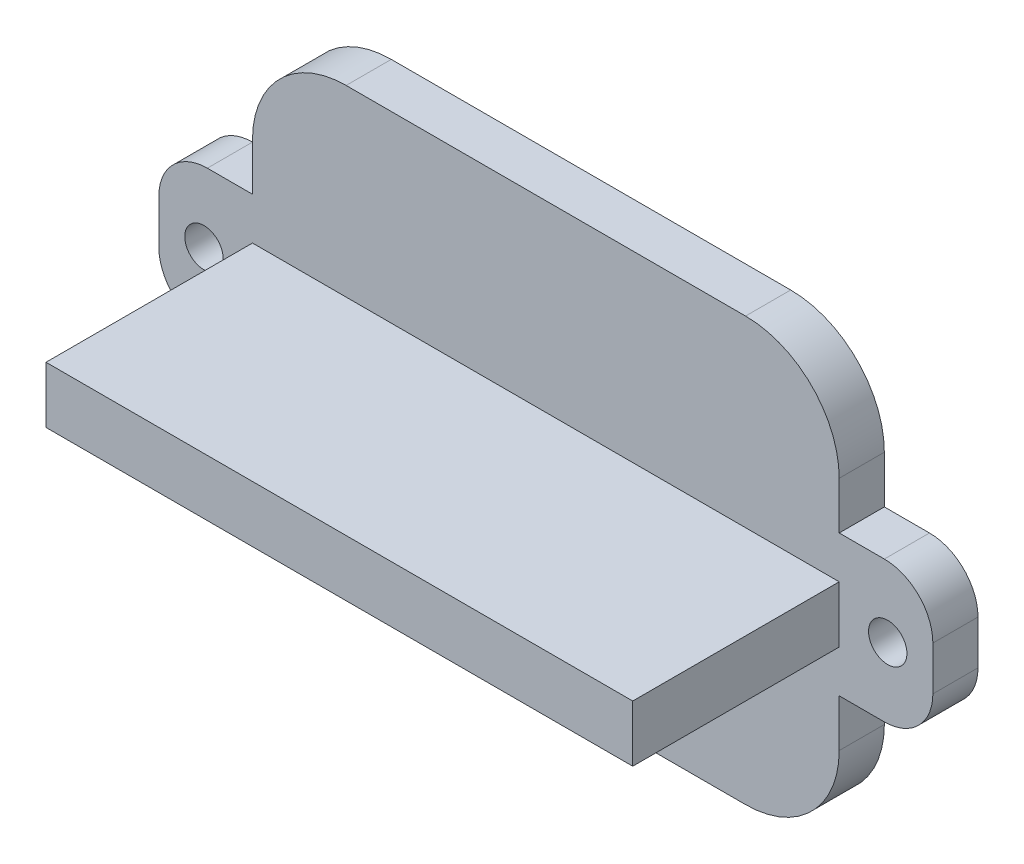
ISO-10303-21;
HEADER;
FILE_DESCRIPTION(('STEP AP214'),'2;1');
FILE_NAME('part.step','',(''),(''),'','','');
FILE_SCHEMA(('AUTOMOTIVE_DESIGN { 1 0 10303 214 1 1 1 1 }'));
ENDSEC;
DATA;
#1=APPLICATION_CONTEXT('core data for automotive mechanical design processes');
#2=APPLICATION_PROTOCOL_DEFINITION('international standard','automotive_design',2000,#1);
#3=PRODUCT_CONTEXT('',#1,'mechanical');
#4=PRODUCT('Part','Part','',(#3));
#5=PRODUCT_RELATED_PRODUCT_CATEGORY('part','',(#4));
#6=PRODUCT_DEFINITION_FORMATION('','',#4);
#7=PRODUCT_DEFINITION_CONTEXT('part definition',#1,'design');
#8=PRODUCT_DEFINITION('design','',#6,#7);
#9=PRODUCT_DEFINITION_SHAPE('','',#8);
#10=(LENGTH_UNIT() NAMED_UNIT(*) SI_UNIT(.MILLI.,.METRE.));
#11=(NAMED_UNIT(*) PLANE_ANGLE_UNIT() SI_UNIT($,.RADIAN.));
#12=(NAMED_UNIT(*) SI_UNIT($,.STERADIAN.) SOLID_ANGLE_UNIT());
#13=UNCERTAINTY_MEASURE_WITH_UNIT(LENGTH_MEASURE(1.E-05),#10,'distance_accuracy_value','');
#14=(GEOMETRIC_REPRESENTATION_CONTEXT(3) GLOBAL_UNCERTAINTY_ASSIGNED_CONTEXT((#13)) GLOBAL_UNIT_ASSIGNED_CONTEXT((#10,
#11,#12)) REPRESENTATION_CONTEXT('',''));
#15=CARTESIAN_POINT('',(0.,0.,0.));
#16=DIRECTION('',(0.,0.,1.));
#17=DIRECTION('',(1.,0.,0.));
#18=AXIS2_PLACEMENT_3D('',#15,#16,#17);
#19=CARTESIAN_POINT('',(0.,0.,2.));
#20=DIRECTION('',(0.,0.,1.));
#21=DIRECTION('',(1.,0.,0.));
#22=AXIS2_PLACEMENT_3D('',#19,#20,#21);
#23=PLANE('',#22);
#24=DIRECTION('',(-1.,0.,0.));
#25=VECTOR('',#24,1.);
#26=CARTESIAN_POINT('',(0.,-9.375,2.));
#27=LINE('',#26,#25);
#28=CARTESIAN_POINT('',(8.84999999999998,-9.375,2.));
#29=VERTEX_POINT('',#28);
#30=CARTESIAN_POINT('',(-8.84999999999997,-9.375,2.));
#31=VERTEX_POINT('',#30);
#32=EDGE_CURVE('E250',#29,#31,#27,.T.);
#33=ORIENTED_EDGE('',*,*,#32,.F.);
#34=CARTESIAN_POINT('',(8.85,-5.225,2.));
#35=DIRECTION('',(0.,0.,1.));
#36=DIRECTION('',(1.,0.,0.));
#37=AXIS2_PLACEMENT_3D('',#34,#35,#36);
#38=CIRCLE('',#37,4.15);
#39=CARTESIAN_POINT('',(13.,-5.22499999999997,2.));
#40=VERTEX_POINT('',#39);
#41=EDGE_CURVE('E248',#29,#40,#38,.T.);
#42=ORIENTED_EDGE('',*,*,#41,.T.);
#43=DIRECTION('',(0.,1.,0.));
#44=VECTOR('',#43,1.);
#45=CARTESIAN_POINT('',(13.,0.,2.));
#46=LINE('',#45,#44);
#47=CARTESIAN_POINT('',(13.,-3.125,2.));
#48=VERTEX_POINT('',#47);
#49=EDGE_CURVE('E246',#40,#48,#46,.T.);
#50=ORIENTED_EDGE('',*,*,#49,.T.);
#51=DIRECTION('',(-1.,0.,0.));
#52=VECTOR('',#51,1.);
#53=CARTESIAN_POINT('',(0.,-3.125,2.));
#54=LINE('',#53,#52);
#55=CARTESIAN_POINT('',(15.,-3.125,2.));
#56=VERTEX_POINT('',#55);
#57=EDGE_CURVE('E243',#56,#48,#54,.T.);
#58=ORIENTED_EDGE('',*,*,#57,.F.);
#59=CARTESIAN_POINT('',(15.,-0.974999999999999,2.));
#60=DIRECTION('',(0.,0.,1.));
#61=DIRECTION('',(1.,0.,0.));
#62=AXIS2_PLACEMENT_3D('',#59,#60,#61);
#63=CIRCLE('',#62,2.15);
#64=CARTESIAN_POINT('',(17.15,-0.974999999999984,2.));
#65=VERTEX_POINT('',#64);
#66=EDGE_CURVE('E241',#56,#65,#63,.T.);
#67=ORIENTED_EDGE('',*,*,#66,.T.);
#68=DIRECTION('',(0.,1.,0.));
#69=VECTOR('',#68,1.);
#70=CARTESIAN_POINT('',(17.15,0.,2.));
#71=LINE('',#70,#69);
#72=CARTESIAN_POINT('',(17.15,0.974999999999984,2.));
#73=VERTEX_POINT('',#72);
#74=EDGE_CURVE('E239',#65,#73,#71,.T.);
#75=ORIENTED_EDGE('',*,*,#74,.T.);
#76=CARTESIAN_POINT('',(15.,0.975,2.));
#77=DIRECTION('',(0.,0.,1.));
#78=DIRECTION('',(1.,0.,0.));
#79=AXIS2_PLACEMENT_3D('',#76,#77,#78);
#80=CIRCLE('',#79,2.15);
#81=CARTESIAN_POINT('',(15.,3.125,2.));
#82=VERTEX_POINT('',#81);
#83=EDGE_CURVE('E237',#73,#82,#80,.T.);
#84=ORIENTED_EDGE('',*,*,#83,.T.);
#85=DIRECTION('',(-1.,0.,0.));
#86=VECTOR('',#85,1.);
#87=CARTESIAN_POINT('',(0.,3.125,2.));
#88=LINE('',#87,#86);
#89=CARTESIAN_POINT('',(13.,3.125,2.));
#90=VERTEX_POINT('',#89);
#91=EDGE_CURVE('E235',#82,#90,#88,.T.);
#92=ORIENTED_EDGE('',*,*,#91,.T.);
#93=CARTESIAN_POINT('',(13.,5.22499999999997,2.));
#94=VERTEX_POINT('',#93);
#95=EDGE_CURVE('E234',#90,#94,#46,.T.);
#96=ORIENTED_EDGE('',*,*,#95,.T.);
#97=CARTESIAN_POINT('',(8.85,5.225,2.));
#98=DIRECTION('',(0.,0.,1.));
#99=DIRECTION('',(1.,0.,0.));
#100=AXIS2_PLACEMENT_3D('',#97,#98,#99);
#101=CIRCLE('',#100,4.15);
#102=CARTESIAN_POINT('',(8.84999999999998,9.375,2.));
#103=VERTEX_POINT('',#102);
#104=EDGE_CURVE('E230',#94,#103,#101,.T.);
#105=ORIENTED_EDGE('',*,*,#104,.T.);
#106=DIRECTION('',(-1.,0.,0.));
#107=VECTOR('',#106,1.);
#108=CARTESIAN_POINT('',(0.,9.375,2.));
#109=LINE('',#108,#107);
#110=CARTESIAN_POINT('',(-8.84999999999997,9.375,2.));
#111=VERTEX_POINT('',#110);
#112=EDGE_CURVE('E227',#103,#111,#109,.T.);
#113=ORIENTED_EDGE('',*,*,#112,.T.);
#114=CARTESIAN_POINT('',(-8.84999999999999,5.225,2.));
#115=DIRECTION('',(0.,0.,1.));
#116=DIRECTION('',(1.,0.,0.));
#117=AXIS2_PLACEMENT_3D('',#114,#115,#116);
#118=CIRCLE('',#117,4.15);
#119=CARTESIAN_POINT('',(-13.,5.22499999999997,2.));
#120=VERTEX_POINT('',#119);
#121=EDGE_CURVE('E222',#120,#111,#118,.F.);
#122=ORIENTED_EDGE('',*,*,#121,.F.);
#123=DIRECTION('',(0.,1.,0.));
#124=VECTOR('',#123,1.);
#125=CARTESIAN_POINT('',(-13.,0.,2.));
#126=LINE('',#125,#124);
#127=CARTESIAN_POINT('',(-13.,3.125,2.));
#128=VERTEX_POINT('',#127);
#129=EDGE_CURVE('E215',#128,#120,#126,.T.);
#130=ORIENTED_EDGE('',*,*,#129,.F.);
#131=DIRECTION('',(-1.,0.,0.));
#132=VECTOR('',#131,1.);
#133=CARTESIAN_POINT('',(0.,3.125,2.));
#134=LINE('',#133,#132);
#135=CARTESIAN_POINT('',(-15.,3.125,2.));
#136=VERTEX_POINT('',#135);
#137=EDGE_CURVE('E221',#128,#136,#134,.T.);
#138=ORIENTED_EDGE('',*,*,#137,.T.);
#139=CARTESIAN_POINT('',(-15.,0.975,2.));
#140=DIRECTION('',(0.,0.,1.));
#141=DIRECTION('',(1.,0.,0.));
#142=AXIS2_PLACEMENT_3D('',#139,#140,#141);
#143=CIRCLE('',#142,2.15);
#144=CARTESIAN_POINT('',(-17.15,0.974999999999985,2.));
#145=VERTEX_POINT('',#144);
#146=EDGE_CURVE('E225',#136,#145,#143,.T.);
#147=ORIENTED_EDGE('',*,*,#146,.T.);
#148=DIRECTION('',(0.,1.,0.));
#149=VECTOR('',#148,1.);
#150=CARTESIAN_POINT('',(-17.15,0.,2.));
#151=LINE('',#150,#149);
#152=CARTESIAN_POINT('',(-17.15,-0.974999999999984,2.));
#153=VERTEX_POINT('',#152);
#154=EDGE_CURVE('E520',#153,#145,#151,.T.);
#155=ORIENTED_EDGE('',*,*,#154,.F.);
#156=CARTESIAN_POINT('',(-15.,-0.974999999999999,2.));
#157=DIRECTION('',(0.,0.,1.));
#158=DIRECTION('',(1.,0.,0.));
#159=AXIS2_PLACEMENT_3D('',#156,#157,#158);
#160=CIRCLE('',#159,2.15);
#161=CARTESIAN_POINT('',(-15.,-3.125,2.));
#162=VERTEX_POINT('',#161);
#163=EDGE_CURVE('E210',#162,#153,#160,.F.);
#164=ORIENTED_EDGE('',*,*,#163,.F.);
#165=DIRECTION('',(-1.,0.,0.));
#166=VECTOR('',#165,1.);
#167=CARTESIAN_POINT('',(0.,-3.125,2.));
#168=LINE('',#167,#166);
#169=CARTESIAN_POINT('',(-13.,-3.125,2.));
#170=VERTEX_POINT('',#169);
#171=EDGE_CURVE('E191',#170,#162,#168,.T.);
#172=ORIENTED_EDGE('',*,*,#171,.F.);
#173=CARTESIAN_POINT('',(-13.,-5.22499999999997,2.));
#174=VERTEX_POINT('',#173);
#175=EDGE_CURVE('E207',#174,#170,#126,.T.);
#176=ORIENTED_EDGE('',*,*,#175,.F.);
#177=CARTESIAN_POINT('',(-8.84999999999999,-5.225,2.));
#178=DIRECTION('',(0.,0.,1.));
#179=DIRECTION('',(1.,0.,0.));
#180=AXIS2_PLACEMENT_3D('',#177,#178,#179);
#181=CIRCLE('',#180,4.15);
#182=EDGE_CURVE('E213',#31,#174,#181,.F.);
#183=ORIENTED_EDGE('',*,*,#182,.F.);
#184=EDGE_LOOP('',(#33,#42,#50,#58,#67,#75,#84,#92,#96,#105,#113,#122,#130,#138,#147,#155,#164,
#172,#176,#183));
#185=FACE_BOUND('',#184,.T.);
#186=CARTESIAN_POINT('',(-15.15,0.,2.));
#187=DIRECTION('',(0.,0.,1.));
#188=DIRECTION('',(1.,0.,0.));
#189=AXIS2_PLACEMENT_3D('',#186,#187,#188);
#190=CIRCLE('',#189,0.850000000000011);
#191=CARTESIAN_POINT('',(-14.3,0.,2.));
#192=VERTEX_POINT('',#191);
#193=EDGE_CURVE('E216',#192,#192,#190,.T.);
#194=ORIENTED_EDGE('',*,*,#193,.F.);
#195=EDGE_LOOP('',(#194));
#196=FACE_BOUND('',#195,.T.);
#197=CARTESIAN_POINT('',(15.15,0.,2.));
#198=DIRECTION('',(0.,0.,1.));
#199=DIRECTION('',(1.,0.,0.));
#200=AXIS2_PLACEMENT_3D('',#197,#198,#199);
#201=CIRCLE('',#200,0.850000000000002);
#202=CARTESIAN_POINT('',(16.,0.,2.));
#203=VERTEX_POINT('',#202);
#204=EDGE_CURVE('E477',#203,#203,#201,.T.);
#205=ORIENTED_EDGE('',*,*,#204,.F.);
#206=EDGE_LOOP('',(#205));
#207=FACE_BOUND('',#206,.T.);
#208=DIRECTION('',(-1.,0.,0.));
#209=VECTOR('',#208,1.);
#210=CARTESIAN_POINT('',(0.,-1.2516224002639,2.));
#211=LINE('',#210,#209);
#212=CARTESIAN_POINT('',(13.,-1.2516224002639,2.));
#213=VERTEX_POINT('',#212);
#214=CARTESIAN_POINT('',(-13.,-1.2516224002639,2.));
#215=VERTEX_POINT('',#214);
#216=EDGE_CURVE('E257',#213,#215,#211,.T.);
#217=ORIENTED_EDGE('',*,*,#216,.T.);
#218=DIRECTION('',(0.,1.,0.));
#219=VECTOR('',#218,1.);
#220=CARTESIAN_POINT('',(-13.,0.,2.));
#221=LINE('',#220,#219);
#222=CARTESIAN_POINT('',(-13.,1.2516224002639,2.));
#223=VERTEX_POINT('',#222);
#224=EDGE_CURVE('E253',#215,#223,#221,.T.);
#225=ORIENTED_EDGE('',*,*,#224,.T.);
#226=DIRECTION('',(1.,0.,0.));
#227=VECTOR('',#226,1.);
#228=CARTESIAN_POINT('',(0.,1.2516224002639,2.));
#229=LINE('',#228,#227);
#230=CARTESIAN_POINT('',(13.,1.2516224002639,2.));
#231=VERTEX_POINT('',#230);
#232=EDGE_CURVE('E263',#223,#231,#229,.T.);
#233=ORIENTED_EDGE('',*,*,#232,.T.);
#234=DIRECTION('',(0.,-1.,0.));
#235=VECTOR('',#234,1.);
#236=CARTESIAN_POINT('',(13.,0.,2.));
#237=LINE('',#236,#235);
#238=EDGE_CURVE('E260',#231,#213,#237,.T.);
#239=ORIENTED_EDGE('',*,*,#238,.T.);
#240=EDGE_LOOP('',(#217,#225,#233,#239));
#241=FACE_BOUND('',#240,.T.);
#242=ADVANCED_FACE('F39',(#185,#196,#207,#241),#23,.T.);
#243=CARTESIAN_POINT('',(0.,-9.375,2.));
#244=DIRECTION('',(0.,-1.,0.));
#245=DIRECTION('',(1.,0.,0.));
#246=AXIS2_PLACEMENT_3D('',#243,#244,#245);
#247=PLANE('',#246);
#248=DIRECTION('',(-1.,0.,0.));
#249=VECTOR('',#248,1.);
#250=CARTESIAN_POINT('',(0.,-9.375,0.));
#251=LINE('',#250,#249);
#252=CARTESIAN_POINT('',(8.84999999999998,-9.375,0.));
#253=VERTEX_POINT('',#252);
#254=CARTESIAN_POINT('',(-8.84999999999997,-9.375,0.));
#255=VERTEX_POINT('',#254);
#256=EDGE_CURVE('E256',#253,#255,#251,.T.);
#257=ORIENTED_EDGE('',*,*,#256,.F.);
#258=DIRECTION('',(0.,0.,-1.));
#259=VECTOR('',#258,1.);
#260=CARTESIAN_POINT('',(8.84999999999998,-9.375,2.));
#261=LINE('',#260,#259);
#262=EDGE_CURVE('E11',#29,#253,#261,.T.);
#263=ORIENTED_EDGE('',*,*,#262,.F.);
#264=ORIENTED_EDGE('',*,*,#32,.T.);
#265=DIRECTION('',(0.,0.,-1.));
#266=VECTOR('',#265,1.);
#267=CARTESIAN_POINT('',(-8.84999999999997,-9.375,2.));
#268=LINE('',#267,#266);
#269=EDGE_CURVE('E63',#31,#255,#268,.T.);
#270=ORIENTED_EDGE('',*,*,#269,.T.);
#271=EDGE_LOOP('',(#257,#263,#264,#270));
#272=FACE_BOUND('',#271,.T.);
#273=ADVANCED_FACE('F41',(#272),#247,.T.);
#274=CARTESIAN_POINT('',(8.85,-5.225,2.));
#275=DIRECTION('',(0.,0.,-1.));
#276=DIRECTION('',(-1.,0.,0.));
#277=AXIS2_PLACEMENT_3D('',#274,#275,#276);
#278=CYLINDRICAL_SURFACE('',#277,4.15);
#279=CARTESIAN_POINT('',(8.85,-5.225,0.));
#280=DIRECTION('',(0.,0.,1.));
#281=DIRECTION('',(1.,0.,0.));
#282=AXIS2_PLACEMENT_3D('',#279,#280,#281);
#283=CIRCLE('',#282,4.15);
#284=CARTESIAN_POINT('',(13.,-5.22499999999997,0.));
#285=VERTEX_POINT('',#284);
#286=EDGE_CURVE('E412',#253,#285,#283,.T.);
#287=ORIENTED_EDGE('',*,*,#286,.T.);
#288=DIRECTION('',(0.,0.,-1.));
#289=VECTOR('',#288,1.);
#290=CARTESIAN_POINT('',(13.,-5.22499999999997,2.));
#291=LINE('',#290,#289);
#292=EDGE_CURVE('E47',#40,#285,#291,.T.);
#293=ORIENTED_EDGE('',*,*,#292,.F.);
#294=ORIENTED_EDGE('',*,*,#41,.F.);
#295=ORIENTED_EDGE('',*,*,#262,.T.);
#296=EDGE_LOOP('',(#287,#293,#294,#295));
#297=FACE_BOUND('',#296,.T.);
#298=ADVANCED_FACE('F329',(#297),#278,.T.);
#299=CARTESIAN_POINT('',(13.,0.,2.));
#300=DIRECTION('',(-1.,0.,0.));
#301=DIRECTION('',(0.,0.,1.));
#302=AXIS2_PLACEMENT_3D('',#299,#300,#301);
#303=PLANE('',#302);
#304=DIRECTION('',(0.,1.,0.));
#305=VECTOR('',#304,1.);
#306=CARTESIAN_POINT('',(13.,0.,0.));
#307=LINE('',#306,#305);
#308=CARTESIAN_POINT('',(13.,-3.125,0.));
#309=VERTEX_POINT('',#308);
#310=EDGE_CURVE('E417',#285,#309,#307,.T.);
#311=ORIENTED_EDGE('',*,*,#310,.T.);
#312=DIRECTION('',(0.,0.,-1.));
#313=VECTOR('',#312,1.);
#314=CARTESIAN_POINT('',(13.,-3.125,2.));
#315=LINE('',#314,#313);
#316=EDGE_CURVE('E422',#48,#309,#315,.T.);
#317=ORIENTED_EDGE('',*,*,#316,.F.);
#318=ORIENTED_EDGE('',*,*,#49,.F.);
#319=ORIENTED_EDGE('',*,*,#292,.T.);
#320=EDGE_LOOP('',(#311,#317,#318,#319));
#321=FACE_BOUND('',#320,.T.);
#322=ADVANCED_FACE('F385',(#321),#303,.F.);
#323=CARTESIAN_POINT('',(0.,-3.125,2.));
#324=DIRECTION('',(0.,-1.,0.));
#325=DIRECTION('',(0.,0.,-1.));
#326=AXIS2_PLACEMENT_3D('',#323,#324,#325);
#327=PLANE('',#326);
#328=DIRECTION('',(-1.,0.,0.));
#329=VECTOR('',#328,1.);
#330=CARTESIAN_POINT('',(0.,-3.125,0.));
#331=LINE('',#330,#329);
#332=CARTESIAN_POINT('',(15.,-3.125,0.));
#333=VERTEX_POINT('',#332);
#334=EDGE_CURVE('E425',#333,#309,#331,.T.);
#335=ORIENTED_EDGE('',*,*,#334,.F.);
#336=DIRECTION('',(0.,0.,-1.));
#337=VECTOR('',#336,1.);
#338=CARTESIAN_POINT('',(15.,-3.125,2.));
#339=LINE('',#338,#337);
#340=EDGE_CURVE('E508',#56,#333,#339,.T.);
#341=ORIENTED_EDGE('',*,*,#340,.F.);
#342=ORIENTED_EDGE('',*,*,#57,.T.);
#343=ORIENTED_EDGE('',*,*,#316,.T.);
#344=EDGE_LOOP('',(#335,#341,#342,#343));
#345=FACE_BOUND('',#344,.T.);
#346=ADVANCED_FACE('F400',(#345),#327,.T.);
#347=CARTESIAN_POINT('',(15.,-0.974999999999999,2.));
#348=DIRECTION('',(0.,0.,-1.));
#349=DIRECTION('',(-1.,0.,0.));
#350=AXIS2_PLACEMENT_3D('',#347,#348,#349);
#351=CYLINDRICAL_SURFACE('',#350,2.15);
#352=CARTESIAN_POINT('',(15.,-0.974999999999999,0.));
#353=DIRECTION('',(0.,0.,1.));
#354=DIRECTION('',(1.,0.,0.));
#355=AXIS2_PLACEMENT_3D('',#352,#353,#354);
#356=CIRCLE('',#355,2.15);
#357=CARTESIAN_POINT('',(17.15,-0.974999999999984,0.));
#358=VERTEX_POINT('',#357);
#359=EDGE_CURVE('E428',#333,#358,#356,.T.);
#360=ORIENTED_EDGE('',*,*,#359,.T.);
#361=DIRECTION('',(0.,0.,-1.));
#362=VECTOR('',#361,1.);
#363=CARTESIAN_POINT('',(17.15,-0.974999999999984,2.));
#364=LINE('',#363,#362);
#365=EDGE_CURVE('E505',#65,#358,#364,.T.);
#366=ORIENTED_EDGE('',*,*,#365,.F.);
#367=ORIENTED_EDGE('',*,*,#66,.F.);
#368=ORIENTED_EDGE('',*,*,#340,.T.);
#369=EDGE_LOOP('',(#360,#366,#367,#368));
#370=FACE_BOUND('',#369,.T.);
#371=ADVANCED_FACE('F396',(#370),#351,.T.);
#372=CARTESIAN_POINT('',(17.15,0.,2.));
#373=DIRECTION('',(-1.,0.,0.));
#374=DIRECTION('',(0.,0.,1.));
#375=AXIS2_PLACEMENT_3D('',#372,#373,#374);
#376=PLANE('',#375);
#377=DIRECTION('',(0.,1.,0.));
#378=VECTOR('',#377,1.);
#379=CARTESIAN_POINT('',(17.15,0.,0.));
#380=LINE('',#379,#378);
#381=CARTESIAN_POINT('',(17.15,0.974999999999984,0.));
#382=VERTEX_POINT('',#381);
#383=EDGE_CURVE('E443',#358,#382,#380,.T.);
#384=ORIENTED_EDGE('',*,*,#383,.T.);
#385=DIRECTION('',(0.,0.,-1.));
#386=VECTOR('',#385,1.);
#387=CARTESIAN_POINT('',(17.15,0.974999999999984,2.));
#388=LINE('',#387,#386);
#389=EDGE_CURVE('E502',#73,#382,#388,.T.);
#390=ORIENTED_EDGE('',*,*,#389,.F.);
#391=ORIENTED_EDGE('',*,*,#74,.F.);
#392=ORIENTED_EDGE('',*,*,#365,.T.);
#393=EDGE_LOOP('',(#384,#390,#391,#392));
#394=FACE_BOUND('',#393,.T.);
#395=ADVANCED_FACE('F392',(#394),#376,.F.);
#396=CARTESIAN_POINT('',(15.,0.975,2.));
#397=DIRECTION('',(0.,0.,-1.));
#398=DIRECTION('',(-1.,0.,0.));
#399=AXIS2_PLACEMENT_3D('',#396,#397,#398);
#400=CYLINDRICAL_SURFACE('',#399,2.15);
#401=CARTESIAN_POINT('',(15.,0.975,0.));
#402=DIRECTION('',(0.,0.,1.));
#403=DIRECTION('',(1.,0.,0.));
#404=AXIS2_PLACEMENT_3D('',#401,#402,#403);
#405=CIRCLE('',#404,2.15);
#406=CARTESIAN_POINT('',(15.,3.125,0.));
#407=VERTEX_POINT('',#406);
#408=EDGE_CURVE('E438',#382,#407,#405,.T.);
#409=ORIENTED_EDGE('',*,*,#408,.T.);
#410=DIRECTION('',(0.,0.,-1.));
#411=VECTOR('',#410,1.);
#412=CARTESIAN_POINT('',(15.,3.125,2.));
#413=LINE('',#412,#411);
#414=EDGE_CURVE('E500',#82,#407,#413,.T.);
#415=ORIENTED_EDGE('',*,*,#414,.F.);
#416=ORIENTED_EDGE('',*,*,#83,.F.);
#417=ORIENTED_EDGE('',*,*,#389,.T.);
#418=EDGE_LOOP('',(#409,#415,#416,#417));
#419=FACE_BOUND('',#418,.T.);
#420=ADVANCED_FACE('F388',(#419),#400,.T.);
#421=CARTESIAN_POINT('',(0.,3.125,2.));
#422=DIRECTION('',(0.,-1.,0.));
#423=DIRECTION('',(0.,0.,-1.));
#424=AXIS2_PLACEMENT_3D('',#421,#422,#423);
#425=PLANE('',#424);
#426=DIRECTION('',(-1.,0.,0.));
#427=VECTOR('',#426,1.);
#428=CARTESIAN_POINT('',(0.,3.125,0.));
#429=LINE('',#428,#427);
#430=CARTESIAN_POINT('',(13.,3.125,0.));
#431=VERTEX_POINT('',#430);
#432=EDGE_CURVE('E431',#407,#431,#429,.T.);
#433=ORIENTED_EDGE('',*,*,#432,.T.);
#434=DIRECTION('',(0.,0.,-1.));
#435=VECTOR('',#434,1.);
#436=CARTESIAN_POINT('',(13.,3.125,2.));
#437=LINE('',#436,#435);
#438=EDGE_CURVE('E498',#90,#431,#437,.T.);
#439=ORIENTED_EDGE('',*,*,#438,.F.);
#440=ORIENTED_EDGE('',*,*,#91,.F.);
#441=ORIENTED_EDGE('',*,*,#414,.T.);
#442=EDGE_LOOP('',(#433,#439,#440,#441));
#443=FACE_BOUND('',#442,.T.);
#444=ADVANCED_FACE('F383',(#443),#425,.F.);
#445=CARTESIAN_POINT('',(13.,5.22499999999997,0.));
#446=VERTEX_POINT('',#445);
#447=EDGE_CURVE('E427',#431,#446,#307,.T.);
#448=ORIENTED_EDGE('',*,*,#447,.T.);
#449=DIRECTION('',(0.,0.,-1.));
#450=VECTOR('',#449,1.);
#451=CARTESIAN_POINT('',(13.,5.22499999999997,2.));
#452=LINE('',#451,#450);
#453=EDGE_CURVE('E496',#94,#446,#452,.T.);
#454=ORIENTED_EDGE('',*,*,#453,.F.);
#455=ORIENTED_EDGE('',*,*,#95,.F.);
#456=ORIENTED_EDGE('',*,*,#438,.T.);
#457=EDGE_LOOP('',(#448,#454,#455,#456));
#458=FACE_BOUND('',#457,.T.);
#459=ADVANCED_FACE('F379',(#458),#303,.F.);
#460=CARTESIAN_POINT('',(8.85,5.225,2.));
#461=DIRECTION('',(0.,0.,-1.));
#462=DIRECTION('',(-1.,0.,0.));
#463=AXIS2_PLACEMENT_3D('',#460,#461,#462);
#464=CYLINDRICAL_SURFACE('',#463,4.15);
#465=CARTESIAN_POINT('',(8.85,5.225,0.));
#466=DIRECTION('',(0.,0.,1.));
#467=DIRECTION('',(1.,0.,0.));
#468=AXIS2_PLACEMENT_3D('',#465,#466,#467);
#469=CIRCLE('',#468,4.15);
#470=CARTESIAN_POINT('',(8.84999999999998,9.375,0.));
#471=VERTEX_POINT('',#470);
#472=EDGE_CURVE('E430',#446,#471,#469,.T.);
#473=ORIENTED_EDGE('',*,*,#472,.T.);
#474=DIRECTION('',(0.,0.,-1.));
#475=VECTOR('',#474,1.);
#476=CARTESIAN_POINT('',(8.84999999999998,9.375,2.));
#477=LINE('',#476,#475);
#478=EDGE_CURVE('E493',#103,#471,#477,.T.);
#479=ORIENTED_EDGE('',*,*,#478,.F.);
#480=ORIENTED_EDGE('',*,*,#104,.F.);
#481=ORIENTED_EDGE('',*,*,#453,.T.);
#482=EDGE_LOOP('',(#473,#479,#480,#481));
#483=FACE_BOUND('',#482,.T.);
#484=ADVANCED_FACE('F375',(#483),#464,.T.);
#485=CARTESIAN_POINT('',(0.,9.375,2.));
#486=DIRECTION('',(0.,-1.,0.));
#487=DIRECTION('',(1.,0.,0.));
#488=AXIS2_PLACEMENT_3D('',#485,#486,#487);
#489=PLANE('',#488);
#490=DIRECTION('',(-1.,0.,0.));
#491=VECTOR('',#490,1.);
#492=CARTESIAN_POINT('',(0.,9.375,0.));
#493=LINE('',#492,#491);
#494=CARTESIAN_POINT('',(-8.84999999999997,9.375,0.));
#495=VERTEX_POINT('',#494);
#496=EDGE_CURVE('E436',#471,#495,#493,.T.);
#497=ORIENTED_EDGE('',*,*,#496,.T.);
#498=DIRECTION('',(0.,0.,-1.));
#499=VECTOR('',#498,1.);
#500=CARTESIAN_POINT('',(-8.84999999999997,9.375,2.));
#501=LINE('',#500,#499);
#502=EDGE_CURVE('E491',#111,#495,#501,.T.);
#503=ORIENTED_EDGE('',*,*,#502,.F.);
#504=ORIENTED_EDGE('',*,*,#112,.F.);
#505=ORIENTED_EDGE('',*,*,#478,.T.);
#506=EDGE_LOOP('',(#497,#503,#504,#505));
#507=FACE_BOUND('',#506,.T.);
#508=ADVANCED_FACE('F372',(#507),#489,.F.);
#509=CARTESIAN_POINT('',(-8.84999999999999,5.225,2.));
#510=DIRECTION('',(0.,0.,-1.));
#511=DIRECTION('',(-1.,0.,0.));
#512=AXIS2_PLACEMENT_3D('',#509,#510,#511);
#513=CYLINDRICAL_SURFACE('',#512,4.15);
#514=CARTESIAN_POINT('',(-8.84999999999999,5.225,0.));
#515=DIRECTION('',(0.,0.,1.));
#516=DIRECTION('',(1.,0.,0.));
#517=AXIS2_PLACEMENT_3D('',#514,#515,#516);
#518=CIRCLE('',#517,4.15);
#519=CARTESIAN_POINT('',(-13.,5.22499999999997,0.));
#520=VERTEX_POINT('',#519);
#521=EDGE_CURVE('E449',#520,#495,#518,.F.);
#522=ORIENTED_EDGE('',*,*,#521,.F.);
#523=DIRECTION('',(0.,0.,-1.));
#524=VECTOR('',#523,1.);
#525=CARTESIAN_POINT('',(-13.,5.22499999999997,2.));
#526=LINE('',#525,#524);
#527=EDGE_CURVE('E489',#120,#520,#526,.T.);
#528=ORIENTED_EDGE('',*,*,#527,.F.);
#529=ORIENTED_EDGE('',*,*,#121,.T.);
#530=ORIENTED_EDGE('',*,*,#502,.T.);
#531=EDGE_LOOP('',(#522,#528,#529,#530));
#532=FACE_BOUND('',#531,.T.);
#533=ADVANCED_FACE('F369',(#532),#513,.T.);
#534=CARTESIAN_POINT('',(-13.,0.,2.));
#535=DIRECTION('',(-1.,0.,0.));
#536=DIRECTION('',(0.,0.,1.));
#537=AXIS2_PLACEMENT_3D('',#534,#535,#536);
#538=PLANE('',#537);
#539=DIRECTION('',(0.,1.,0.));
#540=VECTOR('',#539,1.);
#541=CARTESIAN_POINT('',(-13.,0.,0.));
#542=LINE('',#541,#540);
#543=CARTESIAN_POINT('',(-13.,3.125,0.));
#544=VERTEX_POINT('',#543);
#545=EDGE_CURVE('E452',#544,#520,#542,.T.);
#546=ORIENTED_EDGE('',*,*,#545,.F.);
#547=DIRECTION('',(0.,0.,-1.));
#548=VECTOR('',#547,1.);
#549=CARTESIAN_POINT('',(-13.,3.125,2.));
#550=LINE('',#549,#548);
#551=EDGE_CURVE('E487',#128,#544,#550,.T.);
#552=ORIENTED_EDGE('',*,*,#551,.F.);
#553=ORIENTED_EDGE('',*,*,#129,.T.);
#554=ORIENTED_EDGE('',*,*,#527,.T.);
#555=EDGE_LOOP('',(#546,#552,#553,#554));
#556=FACE_BOUND('',#555,.T.);
#557=ADVANCED_FACE('F350',(#556),#538,.T.);
#558=CARTESIAN_POINT('',(0.,3.125,2.));
#559=DIRECTION('',(0.,-1.,0.));
#560=DIRECTION('',(0.,0.,-1.));
#561=AXIS2_PLACEMENT_3D('',#558,#559,#560);
#562=PLANE('',#561);
#563=DIRECTION('',(-1.,0.,0.));
#564=VECTOR('',#563,1.);
#565=CARTESIAN_POINT('',(0.,3.125,0.));
#566=LINE('',#565,#564);
#567=CARTESIAN_POINT('',(-15.,3.125,0.));
#568=VERTEX_POINT('',#567);
#569=EDGE_CURVE('E455',#544,#568,#566,.T.);
#570=ORIENTED_EDGE('',*,*,#569,.T.);
#571=DIRECTION('',(0.,0.,-1.));
#572=VECTOR('',#571,1.);
#573=CARTESIAN_POINT('',(-15.,3.125,2.));
#574=LINE('',#573,#572);
#575=EDGE_CURVE('E484',#136,#568,#574,.T.);
#576=ORIENTED_EDGE('',*,*,#575,.F.);
#577=ORIENTED_EDGE('',*,*,#137,.F.);
#578=ORIENTED_EDGE('',*,*,#551,.T.);
#579=EDGE_LOOP('',(#570,#576,#577,#578));
#580=FACE_BOUND('',#579,.T.);
#581=ADVANCED_FACE('F364',(#580),#562,.F.);
#582=CARTESIAN_POINT('',(-15.,0.975,2.));
#583=DIRECTION('',(0.,0.,-1.));
#584=DIRECTION('',(-1.,0.,0.));
#585=AXIS2_PLACEMENT_3D('',#582,#583,#584);
#586=CYLINDRICAL_SURFACE('',#585,2.15);
#587=CARTESIAN_POINT('',(-15.,0.975,0.));
#588=DIRECTION('',(0.,0.,1.));
#589=DIRECTION('',(1.,0.,0.));
#590=AXIS2_PLACEMENT_3D('',#587,#588,#589);
#591=CIRCLE('',#590,2.15);
#592=CARTESIAN_POINT('',(-17.15,0.974999999999985,0.));
#593=VERTEX_POINT('',#592);
#594=EDGE_CURVE('E458',#568,#593,#591,.T.);
#595=ORIENTED_EDGE('',*,*,#594,.T.);
#596=DIRECTION('',(0.,0.,-1.));
#597=VECTOR('',#596,1.);
#598=CARTESIAN_POINT('',(-17.15,0.974999999999985,2.));
#599=LINE('',#598,#597);
#600=EDGE_CURVE('E482',#145,#593,#599,.T.);
#601=ORIENTED_EDGE('',*,*,#600,.F.);
#602=ORIENTED_EDGE('',*,*,#146,.F.);
#603=ORIENTED_EDGE('',*,*,#575,.T.);
#604=EDGE_LOOP('',(#595,#601,#602,#603));
#605=FACE_BOUND('',#604,.T.);
#606=ADVANCED_FACE('F360',(#605),#586,.T.);
#607=CARTESIAN_POINT('',(-17.15,0.,2.));
#608=DIRECTION('',(-1.,0.,0.));
#609=DIRECTION('',(0.,0.,1.));
#610=AXIS2_PLACEMENT_3D('',#607,#608,#609);
#611=PLANE('',#610);
#612=DIRECTION('',(0.,1.,0.));
#613=VECTOR('',#612,1.);
#614=CARTESIAN_POINT('',(-17.15,0.,0.));
#615=LINE('',#614,#613);
#616=CARTESIAN_POINT('',(-17.15,-0.974999999999984,0.));
#617=VERTEX_POINT('',#616);
#618=EDGE_CURVE('E461',#617,#593,#615,.T.);
#619=ORIENTED_EDGE('',*,*,#618,.F.);
#620=DIRECTION('',(0.,0.,-1.));
#621=VECTOR('',#620,1.);
#622=CARTESIAN_POINT('',(-17.15,-0.974999999999984,2.));
#623=LINE('',#622,#621);
#624=EDGE_CURVE('E480',#153,#617,#623,.T.);
#625=ORIENTED_EDGE('',*,*,#624,.F.);
#626=ORIENTED_EDGE('',*,*,#154,.T.);
#627=ORIENTED_EDGE('',*,*,#600,.T.);
#628=EDGE_LOOP('',(#619,#625,#626,#627));
#629=FACE_BOUND('',#628,.T.);
#630=ADVANCED_FACE('F356',(#629),#611,.T.);
#631=CARTESIAN_POINT('',(-15.,-0.974999999999999,2.));
#632=DIRECTION('',(0.,0.,-1.));
#633=DIRECTION('',(-1.,0.,0.));
#634=AXIS2_PLACEMENT_3D('',#631,#632,#633);
#635=CYLINDRICAL_SURFACE('',#634,2.15);
#636=CARTESIAN_POINT('',(-15.,-0.974999999999999,0.));
#637=DIRECTION('',(0.,0.,1.));
#638=DIRECTION('',(1.,0.,0.));
#639=AXIS2_PLACEMENT_3D('',#636,#637,#638);
#640=CIRCLE('',#639,2.15);
#641=CARTESIAN_POINT('',(-15.,-3.125,0.));
#642=VERTEX_POINT('',#641);
#643=EDGE_CURVE('E464',#642,#617,#640,.F.);
#644=ORIENTED_EDGE('',*,*,#643,.F.);
#645=DIRECTION('',(0.,0.,-1.));
#646=VECTOR('',#645,1.);
#647=CARTESIAN_POINT('',(-15.,-3.125,2.));
#648=LINE('',#647,#646);
#649=EDGE_CURVE('E198',#162,#642,#648,.T.);
#650=ORIENTED_EDGE('',*,*,#649,.F.);
#651=ORIENTED_EDGE('',*,*,#163,.T.);
#652=ORIENTED_EDGE('',*,*,#624,.T.);
#653=EDGE_LOOP('',(#644,#650,#651,#652));
#654=FACE_BOUND('',#653,.T.);
#655=ADVANCED_FACE('F353',(#654),#635,.T.);
#656=CARTESIAN_POINT('',(0.,-3.125,2.));
#657=DIRECTION('',(0.,-1.,0.));
#658=DIRECTION('',(0.,0.,-1.));
#659=AXIS2_PLACEMENT_3D('',#656,#657,#658);
#660=PLANE('',#659);
#661=DIRECTION('',(-1.,0.,0.));
#662=VECTOR('',#661,1.);
#663=CARTESIAN_POINT('',(0.,-3.125,0.));
#664=LINE('',#663,#662);
#665=CARTESIAN_POINT('',(-13.,-3.125,0.));
#666=VERTEX_POINT('',#665);
#667=EDGE_CURVE('E193',#666,#642,#664,.T.);
#668=ORIENTED_EDGE('',*,*,#667,.F.);
#669=DIRECTION('',(0.,0.,-1.));
#670=VECTOR('',#669,1.);
#671=CARTESIAN_POINT('',(-13.,-3.125,2.));
#672=LINE('',#671,#670);
#673=EDGE_CURVE('E188',#170,#666,#672,.T.);
#674=ORIENTED_EDGE('',*,*,#673,.F.);
#675=ORIENTED_EDGE('',*,*,#171,.T.);
#676=ORIENTED_EDGE('',*,*,#649,.T.);
#677=EDGE_LOOP('',(#668,#674,#675,#676));
#678=FACE_BOUND('',#677,.T.);
#679=ADVANCED_FACE('F190',(#678),#660,.T.);
#680=CARTESIAN_POINT('',(-13.,-5.22499999999997,0.));
#681=VERTEX_POINT('',#680);
#682=EDGE_CURVE('E456',#681,#666,#542,.T.);
#683=ORIENTED_EDGE('',*,*,#682,.F.);
#684=DIRECTION('',(0.,0.,-1.));
#685=VECTOR('',#684,1.);
#686=CARTESIAN_POINT('',(-13.,-5.22499999999997,2.));
#687=LINE('',#686,#685);
#688=EDGE_CURVE('E199',#174,#681,#687,.T.);
#689=ORIENTED_EDGE('',*,*,#688,.F.);
#690=ORIENTED_EDGE('',*,*,#175,.T.);
#691=ORIENTED_EDGE('',*,*,#673,.T.);
#692=EDGE_LOOP('',(#683,#689,#690,#691));
#693=FACE_BOUND('',#692,.T.);
#694=ADVANCED_FACE('F212',(#693),#538,.T.);
#695=CARTESIAN_POINT('',(-15.15,0.,2.));
#696=DIRECTION('',(0.,0.,-1.));
#697=DIRECTION('',(-1.,0.,0.));
#698=AXIS2_PLACEMENT_3D('',#695,#696,#697);
#699=CYLINDRICAL_SURFACE('',#698,0.850000000000011);
#700=ORIENTED_EDGE('',*,*,#193,.T.);
#701=EDGE_LOOP('',(#700));
#702=FACE_BOUND('',#701,.T.);
#703=CARTESIAN_POINT('',(-15.15,0.,0.));
#704=DIRECTION('',(0.,0.,1.));
#705=DIRECTION('',(1.,0.,0.));
#706=AXIS2_PLACEMENT_3D('',#703,#704,#705);
#707=CIRCLE('',#706,0.850000000000011);
#708=CARTESIAN_POINT('',(-14.3,0.,0.));
#709=VERTEX_POINT('',#708);
#710=EDGE_CURVE('E471',#709,#709,#707,.T.);
#711=ORIENTED_EDGE('',*,*,#710,.F.);
#712=EDGE_LOOP('',(#711));
#713=FACE_BOUND('',#712,.T.);
#714=ADVANCED_FACE('F342',(#702,#713),#699,.F.);
#715=CARTESIAN_POINT('',(-8.84999999999999,-5.225,2.));
#716=DIRECTION('',(0.,0.,-1.));
#717=DIRECTION('',(-1.,0.,0.));
#718=AXIS2_PLACEMENT_3D('',#715,#716,#717);
#719=CYLINDRICAL_SURFACE('',#718,4.15);
#720=CARTESIAN_POINT('',(-8.84999999999999,-5.225,0.));
#721=DIRECTION('',(0.,0.,1.));
#722=DIRECTION('',(1.,0.,0.));
#723=AXIS2_PLACEMENT_3D('',#720,#721,#722);
#724=CIRCLE('',#723,4.15);
#725=EDGE_CURVE('E468',#255,#681,#724,.F.);
#726=ORIENTED_EDGE('',*,*,#725,.F.);
#727=ORIENTED_EDGE('',*,*,#269,.F.);
#728=ORIENTED_EDGE('',*,*,#182,.T.);
#729=ORIENTED_EDGE('',*,*,#688,.T.);
#730=EDGE_LOOP('',(#726,#727,#728,#729));
#731=FACE_BOUND('',#730,.T.);
#732=ADVANCED_FACE('F340',(#731),#719,.T.);
#733=CARTESIAN_POINT('',(15.15,0.,2.));
#734=DIRECTION('',(0.,0.,-1.));
#735=DIRECTION('',(-1.,0.,0.));
#736=AXIS2_PLACEMENT_3D('',#733,#734,#735);
#737=CYLINDRICAL_SURFACE('',#736,0.850000000000002);
#738=ORIENTED_EDGE('',*,*,#204,.T.);
#739=EDGE_LOOP('',(#738));
#740=FACE_BOUND('',#739,.T.);
#741=CARTESIAN_POINT('',(15.15,0.,0.));
#742=DIRECTION('',(0.,0.,1.));
#743=DIRECTION('',(1.,0.,0.));
#744=AXIS2_PLACEMENT_3D('',#741,#742,#743);
#745=CIRCLE('',#744,0.850000000000002);
#746=CARTESIAN_POINT('',(16.,0.,0.));
#747=VERTEX_POINT('',#746);
#748=EDGE_CURVE('E252',#747,#747,#745,.T.);
#749=ORIENTED_EDGE('',*,*,#748,.F.);
#750=EDGE_LOOP('',(#749));
#751=FACE_BOUND('',#750,.T.);
#752=ADVANCED_FACE('F336',(#740,#751),#737,.F.);
#753=CARTESIAN_POINT('',(0.,0.,0.));
#754=DIRECTION('',(0.,0.,1.));
#755=DIRECTION('',(1.,0.,0.));
#756=AXIS2_PLACEMENT_3D('',#753,#754,#755);
#757=PLANE('',#756);
#758=ORIENTED_EDGE('',*,*,#748,.T.);
#759=EDGE_LOOP('',(#758));
#760=FACE_BOUND('',#759,.T.);
#761=ORIENTED_EDGE('',*,*,#710,.T.);
#762=EDGE_LOOP('',(#761));
#763=FACE_BOUND('',#762,.T.);
#764=ORIENTED_EDGE('',*,*,#256,.T.);
#765=ORIENTED_EDGE('',*,*,#725,.T.);
#766=ORIENTED_EDGE('',*,*,#682,.T.);
#767=ORIENTED_EDGE('',*,*,#667,.T.);
#768=ORIENTED_EDGE('',*,*,#643,.T.);
#769=ORIENTED_EDGE('',*,*,#618,.T.);
#770=ORIENTED_EDGE('',*,*,#594,.F.);
#771=ORIENTED_EDGE('',*,*,#569,.F.);
#772=ORIENTED_EDGE('',*,*,#545,.T.);
#773=ORIENTED_EDGE('',*,*,#521,.T.);
#774=ORIENTED_EDGE('',*,*,#496,.F.);
#775=ORIENTED_EDGE('',*,*,#472,.F.);
#776=ORIENTED_EDGE('',*,*,#447,.F.);
#777=ORIENTED_EDGE('',*,*,#432,.F.);
#778=ORIENTED_EDGE('',*,*,#408,.F.);
#779=ORIENTED_EDGE('',*,*,#383,.F.);
#780=ORIENTED_EDGE('',*,*,#359,.F.);
#781=ORIENTED_EDGE('',*,*,#334,.T.);
#782=ORIENTED_EDGE('',*,*,#310,.F.);
#783=ORIENTED_EDGE('',*,*,#286,.F.);
#784=EDGE_LOOP('',(#764,#765,#766,#767,#768,#769,#770,#771,#772,#773,#774,#775,#776,#777,#778,
#779,#780,#781,#782,#783));
#785=FACE_BOUND('',#784,.T.);
#786=ADVANCED_FACE('F333',(#760,#763,#785),#757,.F.);
#787=CARTESIAN_POINT('',(-13.,1.2516224002639,11.15));
#788=DIRECTION('',(1.,0.,0.));
#789=DIRECTION('',(0.,0.,-1.));
#790=AXIS2_PLACEMENT_3D('',#787,#788,#789);
#791=PLANE('',#790);
#792=ORIENTED_EDGE('',*,*,#224,.F.);
#793=DIRECTION('',(0.,0.,-1.));
#794=VECTOR('',#793,1.);
#795=CARTESIAN_POINT('',(-13.,-1.2516224002639,11.15));
#796=LINE('',#795,#794);
#797=CARTESIAN_POINT('',(-13.,-1.2516224002639,11.15));
#798=VERTEX_POINT('',#797);
#799=EDGE_CURVE('E266',#798,#215,#796,.T.);
#800=ORIENTED_EDGE('',*,*,#799,.F.);
#801=DIRECTION('',(0.,-1.,0.));
#802=VECTOR('',#801,1.);
#803=CARTESIAN_POINT('',(-13.,1.2516224002639,11.15));
#804=LINE('',#803,#802);
#805=CARTESIAN_POINT('',(-13.,1.2516224002639,11.15));
#806=VERTEX_POINT('',#805);
#807=EDGE_CURVE('E285',#806,#798,#804,.T.);
#808=ORIENTED_EDGE('',*,*,#807,.F.);
#809=DIRECTION('',(0.,0.,-1.));
#810=VECTOR('',#809,1.);
#811=CARTESIAN_POINT('',(-13.,1.2516224002639,11.15));
#812=LINE('',#811,#810);
#813=EDGE_CURVE('E273',#806,#223,#812,.T.);
#814=ORIENTED_EDGE('',*,*,#813,.T.);
#815=EDGE_LOOP('',(#792,#800,#808,#814));
#816=FACE_BOUND('',#815,.T.);
#817=ADVANCED_FACE('F300',(#816),#791,.F.);
#818=CARTESIAN_POINT('',(13.,-1.2516224002639,11.15));
#819=DIRECTION('',(0.,1.,0.));
#820=DIRECTION('',(0.,0.,1.));
#821=AXIS2_PLACEMENT_3D('',#818,#819,#820);
#822=PLANE('',#821);
#823=ORIENTED_EDGE('',*,*,#216,.F.);
#824=DIRECTION('',(0.,0.,-1.));
#825=VECTOR('',#824,1.);
#826=CARTESIAN_POINT('',(13.,-1.2516224002639,11.15));
#827=LINE('',#826,#825);
#828=CARTESIAN_POINT('',(13.,-1.2516224002639,11.15));
#829=VERTEX_POINT('',#828);
#830=EDGE_CURVE('E269',#829,#213,#827,.T.);
#831=ORIENTED_EDGE('',*,*,#830,.F.);
#832=DIRECTION('',(1.,0.,0.));
#833=VECTOR('',#832,1.);
#834=CARTESIAN_POINT('',(13.,-1.2516224002639,11.15));
#835=LINE('',#834,#833);
#836=EDGE_CURVE('E282',#798,#829,#835,.T.);
#837=ORIENTED_EDGE('',*,*,#836,.F.);
#838=ORIENTED_EDGE('',*,*,#799,.T.);
#839=EDGE_LOOP('',(#823,#831,#837,#838));
#840=FACE_BOUND('',#839,.T.);
#841=ADVANCED_FACE('F303',(#840),#822,.F.);
#842=CARTESIAN_POINT('',(13.,1.2516224002639,11.15));
#843=DIRECTION('',(-1.,0.,0.));
#844=DIRECTION('',(0.,0.,1.));
#845=AXIS2_PLACEMENT_3D('',#842,#843,#844);
#846=PLANE('',#845);
#847=ORIENTED_EDGE('',*,*,#238,.F.);
#848=DIRECTION('',(0.,0.,-1.));
#849=VECTOR('',#848,1.);
#850=CARTESIAN_POINT('',(13.,1.2516224002639,11.15));
#851=LINE('',#850,#849);
#852=CARTESIAN_POINT('',(13.,1.2516224002639,11.15));
#853=VERTEX_POINT('',#852);
#854=EDGE_CURVE('E54',#853,#231,#851,.T.);
#855=ORIENTED_EDGE('',*,*,#854,.F.);
#856=DIRECTION('',(0.,1.,0.));
#857=VECTOR('',#856,1.);
#858=CARTESIAN_POINT('',(13.,1.2516224002639,11.15));
#859=LINE('',#858,#857);
#860=EDGE_CURVE('E279',#829,#853,#859,.T.);
#861=ORIENTED_EDGE('',*,*,#860,.F.);
#862=ORIENTED_EDGE('',*,*,#830,.T.);
#863=EDGE_LOOP('',(#847,#855,#861,#862));
#864=FACE_BOUND('',#863,.T.);
#865=ADVANCED_FACE('F308',(#864),#846,.F.);
#866=CARTESIAN_POINT('',(13.,1.2516224002639,11.15));
#867=DIRECTION('',(0.,-1.,0.));
#868=DIRECTION('',(0.,0.,-1.));
#869=AXIS2_PLACEMENT_3D('',#866,#867,#868);
#870=PLANE('',#869);
#871=ORIENTED_EDGE('',*,*,#232,.F.);
#872=ORIENTED_EDGE('',*,*,#813,.F.);
#873=DIRECTION('',(-1.,0.,0.));
#874=VECTOR('',#873,1.);
#875=CARTESIAN_POINT('',(13.,1.2516224002639,11.15));
#876=LINE('',#875,#874);
#877=EDGE_CURVE('E276',#853,#806,#876,.T.);
#878=ORIENTED_EDGE('',*,*,#877,.F.);
#879=ORIENTED_EDGE('',*,*,#854,.T.);
#880=EDGE_LOOP('',(#871,#872,#878,#879));
#881=FACE_BOUND('',#880,.T.);
#882=ADVANCED_FACE('F315',(#881),#870,.F.);
#883=CARTESIAN_POINT('',(0.,0.,11.15));
#884=DIRECTION('',(0.,0.,-1.));
#885=DIRECTION('',(-1.,0.,0.));
#886=AXIS2_PLACEMENT_3D('',#883,#884,#885);
#887=PLANE('',#886);
#888=ORIENTED_EDGE('',*,*,#807,.T.);
#889=ORIENTED_EDGE('',*,*,#836,.T.);
#890=ORIENTED_EDGE('',*,*,#860,.T.);
#891=ORIENTED_EDGE('',*,*,#877,.T.);
#892=EDGE_LOOP('',(#888,#889,#890,#891));
#893=FACE_BOUND('',#892,.T.);
#894=ADVANCED_FACE('F291',(#893),#887,.F.);
#895=CLOSED_SHELL('',(#242,#273,#298,#322,#346,#371,#395,#420,#444,#459,#484,#508,#533,#557,
#581,#606,#630,#655,#679,#694,#714,#732,#752,#786,#817,#841,#865,#882,#894));
#896=MANIFOLD_SOLID_BREP('B2',#895);
#897=ADVANCED_BREP_SHAPE_REPRESENTATION('',(#18,#896),#14);
#898=SHAPE_DEFINITION_REPRESENTATION(#9,#897);
ENDSEC;
END-ISO-10303-21;
